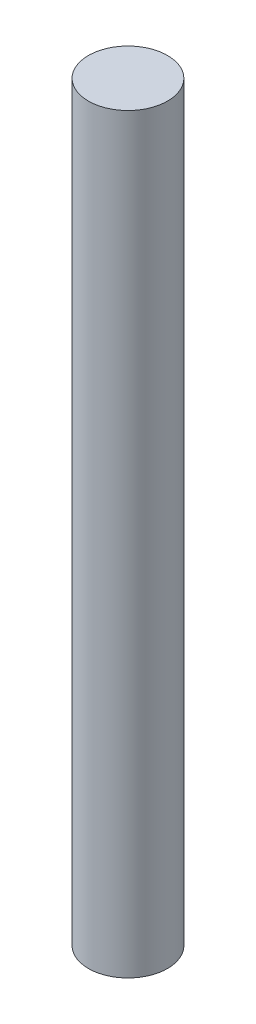
ISO-10303-21;
HEADER;
FILE_DESCRIPTION(('STEP AP214'),'2;1');
FILE_NAME('part.step','',(''),(''),'','','');
FILE_SCHEMA(('AUTOMOTIVE_DESIGN { 1 0 10303 214 1 1 1 1 }'));
ENDSEC;
DATA;
#1=APPLICATION_CONTEXT('core data for automotive mechanical design processes');
#2=APPLICATION_PROTOCOL_DEFINITION('international standard','automotive_design',2000,#1);
#3=PRODUCT_CONTEXT('',#1,'mechanical');
#4=PRODUCT('Part','Part','',(#3));
#5=PRODUCT_RELATED_PRODUCT_CATEGORY('part','',(#4));
#6=PRODUCT_DEFINITION_FORMATION('','',#4);
#7=PRODUCT_DEFINITION_CONTEXT('part definition',#1,'design');
#8=PRODUCT_DEFINITION('design','',#6,#7);
#9=PRODUCT_DEFINITION_SHAPE('','',#8);
#10=(LENGTH_UNIT() NAMED_UNIT(*) SI_UNIT(.MILLI.,.METRE.));
#11=(NAMED_UNIT(*) PLANE_ANGLE_UNIT() SI_UNIT($,.RADIAN.));
#12=(NAMED_UNIT(*) SI_UNIT($,.STERADIAN.) SOLID_ANGLE_UNIT());
#13=UNCERTAINTY_MEASURE_WITH_UNIT(LENGTH_MEASURE(1.E-05),#10,'distance_accuracy_value','');
#14=(GEOMETRIC_REPRESENTATION_CONTEXT(3) GLOBAL_UNCERTAINTY_ASSIGNED_CONTEXT((#13)) GLOBAL_UNIT_ASSIGNED_CONTEXT((#10,
#11,#12)) REPRESENTATION_CONTEXT('',''));
#15=CARTESIAN_POINT('',(0.,0.,0.));
#16=DIRECTION('',(0.,0.,1.));
#17=DIRECTION('',(1.,0.,0.));
#18=AXIS2_PLACEMENT_3D('',#15,#16,#17);
#19=CARTESIAN_POINT('',(0.,-4.826,0.));
#20=DIRECTION('',(0.,1.,0.));
#21=DIRECTION('',(0.,0.,1.));
#22=AXIS2_PLACEMENT_3D('',#19,#20,#21);
#23=CYLINDRICAL_SURFACE('',#22,0.254000000000001);
#24=CARTESIAN_POINT('',(0.,-4.826,0.));
#25=DIRECTION('',(0.,1.,0.));
#26=DIRECTION('',(0.,0.,1.));
#27=AXIS2_PLACEMENT_3D('',#24,#25,#26);
#28=CIRCLE('',#27,0.254000000000001);
#29=CARTESIAN_POINT('',(0.,-4.826,0.254000000000001));
#30=VERTEX_POINT('',#29);
#31=EDGE_CURVE('E10',#30,#30,#28,.T.);
#32=ORIENTED_EDGE('',*,*,#31,.T.);
#33=EDGE_LOOP('',(#32));
#34=FACE_BOUND('',#33,.T.);
#35=CARTESIAN_POINT('',(0.,0.,0.));
#36=DIRECTION('',(0.,1.,0.));
#37=DIRECTION('',(0.,0.,1.));
#38=AXIS2_PLACEMENT_3D('',#35,#36,#37);
#39=CIRCLE('',#38,0.254000000000001);
#40=CARTESIAN_POINT('',(0.,0.,0.254000000000001));
#41=VERTEX_POINT('',#40);
#42=EDGE_CURVE('E34',#41,#41,#39,.T.);
#43=ORIENTED_EDGE('',*,*,#42,.F.);
#44=EDGE_LOOP('',(#43));
#45=FACE_BOUND('',#44,.T.);
#46=ADVANCED_FACE('F31',(#34,#45),#23,.T.);
#47=CARTESIAN_POINT('',(0.,-4.826,0.));
#48=DIRECTION('',(0.,1.,0.));
#49=DIRECTION('',(0.,0.,1.));
#50=AXIS2_PLACEMENT_3D('',#47,#48,#49);
#51=PLANE('',#50);
#52=ORIENTED_EDGE('',*,*,#31,.F.);
#53=EDGE_LOOP('',(#52));
#54=FACE_BOUND('',#53,.T.);
#55=ADVANCED_FACE('F46',(#54),#51,.F.);
#56=CARTESIAN_POINT('',(0.,0.,0.));
#57=DIRECTION('',(0.,1.,0.));
#58=DIRECTION('',(0.,0.,1.));
#59=AXIS2_PLACEMENT_3D('',#56,#57,#58);
#60=PLANE('',#59);
#61=ORIENTED_EDGE('',*,*,#42,.T.);
#62=EDGE_LOOP('',(#61));
#63=FACE_BOUND('',#62,.T.);
#64=ADVANCED_FACE('F43',(#63),#60,.T.);
#65=CLOSED_SHELL('',(#46,#55,#64));
#66=MANIFOLD_SOLID_BREP('B2',#65);
#67=ADVANCED_BREP_SHAPE_REPRESENTATION('',(#18,#66),#14);
#68=SHAPE_DEFINITION_REPRESENTATION(#9,#67);
ENDSEC;
END-ISO-10303-21;
